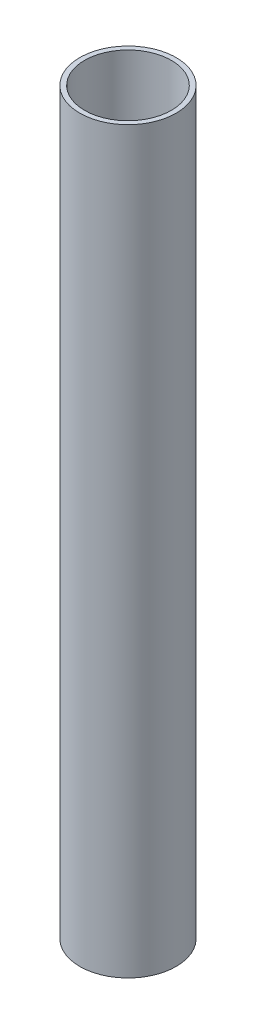
ISO-10303-21;
HEADER;
FILE_DESCRIPTION(('STEP AP214'),'2;1');
FILE_NAME('part.step','',(''),(''),'','','');
FILE_SCHEMA(('AUTOMOTIVE_DESIGN { 1 0 10303 214 1 1 1 1 }'));
ENDSEC;
DATA;
#1=APPLICATION_CONTEXT('core data for automotive mechanical design processes');
#2=APPLICATION_PROTOCOL_DEFINITION('international standard','automotive_design',2000,#1);
#3=PRODUCT_CONTEXT('',#1,'mechanical');
#4=PRODUCT('Part','Part','',(#3));
#5=PRODUCT_RELATED_PRODUCT_CATEGORY('part','',(#4));
#6=PRODUCT_DEFINITION_FORMATION('','',#4);
#7=PRODUCT_DEFINITION_CONTEXT('part definition',#1,'design');
#8=PRODUCT_DEFINITION('design','',#6,#7);
#9=PRODUCT_DEFINITION_SHAPE('','',#8);
#10=(LENGTH_UNIT() NAMED_UNIT(*) SI_UNIT(.MILLI.,.METRE.));
#11=(NAMED_UNIT(*) PLANE_ANGLE_UNIT() SI_UNIT($,.RADIAN.));
#12=(NAMED_UNIT(*) SI_UNIT($,.STERADIAN.) SOLID_ANGLE_UNIT());
#13=UNCERTAINTY_MEASURE_WITH_UNIT(LENGTH_MEASURE(1.E-05),#10,'distance_accuracy_value','');
#14=(GEOMETRIC_REPRESENTATION_CONTEXT(3) GLOBAL_UNCERTAINTY_ASSIGNED_CONTEXT((#13)) GLOBAL_UNIT_ASSIGNED_CONTEXT((#10,
#11,#12)) REPRESENTATION_CONTEXT('',''));
#15=CARTESIAN_POINT('',(0.,0.,0.));
#16=DIRECTION('',(0.,0.,1.));
#17=DIRECTION('',(1.,0.,0.));
#18=AXIS2_PLACEMENT_3D('',#15,#16,#17);
#19=CARTESIAN_POINT('',(0.,115.,0.));
#20=DIRECTION('',(0.,1.,0.));
#21=DIRECTION('',(0.,0.,1.));
#22=AXIS2_PLACEMENT_3D('',#19,#20,#21);
#23=PLANE('',#22);
#24=CARTESIAN_POINT('',(0.,115.,0.));
#25=DIRECTION('',(0.,1.,0.));
#26=DIRECTION('',(0.,0.,1.));
#27=AXIS2_PLACEMENT_3D('',#24,#25,#26);
#28=CIRCLE('',#27,15.);
#29=CARTESIAN_POINT('',(0.,115.,15.));
#30=VERTEX_POINT('',#29);
#31=EDGE_CURVE('E10',#30,#30,#28,.T.);
#32=ORIENTED_EDGE('',*,*,#31,.T.);
#33=EDGE_LOOP('',(#32));
#34=FACE_BOUND('',#33,.T.);
#35=CARTESIAN_POINT('',(0.,115.,0.));
#36=DIRECTION('',(0.,1.,0.));
#37=DIRECTION('',(0.,0.,1.));
#38=AXIS2_PLACEMENT_3D('',#35,#36,#37);
#39=CIRCLE('',#38,13.5);
#40=CARTESIAN_POINT('',(0.,115.,13.5));
#41=VERTEX_POINT('',#40);
#42=EDGE_CURVE('E44',#41,#41,#39,.T.);
#43=ORIENTED_EDGE('',*,*,#42,.F.);
#44=EDGE_LOOP('',(#43));
#45=FACE_BOUND('',#44,.T.);
#46=ADVANCED_FACE('F33',(#34,#45),#23,.T.);
#47=CARTESIAN_POINT('',(0.,-115.,0.));
#48=DIRECTION('',(0.,1.,0.));
#49=DIRECTION('',(0.,0.,1.));
#50=AXIS2_PLACEMENT_3D('',#47,#48,#49);
#51=PLANE('',#50);
#52=CARTESIAN_POINT('',(0.,-115.,0.));
#53=DIRECTION('',(0.,1.,0.));
#54=DIRECTION('',(0.,0.,1.));
#55=AXIS2_PLACEMENT_3D('',#52,#53,#54);
#56=CIRCLE('',#55,15.);
#57=CARTESIAN_POINT('',(0.,-115.,15.));
#58=VERTEX_POINT('',#57);
#59=EDGE_CURVE('E37',#58,#58,#56,.T.);
#60=ORIENTED_EDGE('',*,*,#59,.F.);
#61=EDGE_LOOP('',(#60));
#62=FACE_BOUND('',#61,.T.);
#63=CARTESIAN_POINT('',(0.,-115.,0.));
#64=DIRECTION('',(0.,1.,0.));
#65=DIRECTION('',(0.,0.,1.));
#66=AXIS2_PLACEMENT_3D('',#63,#64,#65);
#67=CIRCLE('',#66,13.5);
#68=CARTESIAN_POINT('',(0.,-115.,13.5));
#69=VERTEX_POINT('',#68);
#70=EDGE_CURVE('E46',#69,#69,#67,.T.);
#71=ORIENTED_EDGE('',*,*,#70,.T.);
#72=EDGE_LOOP('',(#71));
#73=FACE_BOUND('',#72,.T.);
#74=ADVANCED_FACE('F56',(#62,#73),#51,.F.);
#75=CARTESIAN_POINT('',(0.,115.,0.));
#76=DIRECTION('',(0.,-1.,0.));
#77=DIRECTION('',(0.,0.,-1.));
#78=AXIS2_PLACEMENT_3D('',#75,#76,#77);
#79=CYLINDRICAL_SURFACE('',#78,15.);
#80=ORIENTED_EDGE('',*,*,#31,.F.);
#81=EDGE_LOOP('',(#80));
#82=FACE_BOUND('',#81,.T.);
#83=ORIENTED_EDGE('',*,*,#59,.T.);
#84=EDGE_LOOP('',(#83));
#85=FACE_BOUND('',#84,.T.);
#86=ADVANCED_FACE('F35',(#82,#85),#79,.T.);
#87=CARTESIAN_POINT('',(0.,115.,0.));
#88=DIRECTION('',(0.,-1.,0.));
#89=DIRECTION('',(0.,0.,-1.));
#90=AXIS2_PLACEMENT_3D('',#87,#88,#89);
#91=CYLINDRICAL_SURFACE('',#90,13.5);
#92=ORIENTED_EDGE('',*,*,#42,.T.);
#93=EDGE_LOOP('',(#92));
#94=FACE_BOUND('',#93,.T.);
#95=ORIENTED_EDGE('',*,*,#70,.F.);
#96=EDGE_LOOP('',(#95));
#97=FACE_BOUND('',#96,.T.);
#98=ADVANCED_FACE('F52',(#94,#97),#91,.F.);
#99=CLOSED_SHELL('',(#46,#74,#86,#98));
#100=MANIFOLD_SOLID_BREP('B2',#99);
#101=ADVANCED_BREP_SHAPE_REPRESENTATION('',(#18,#100),#14);
#102=SHAPE_DEFINITION_REPRESENTATION(#9,#101);
ENDSEC;
END-ISO-10303-21;
